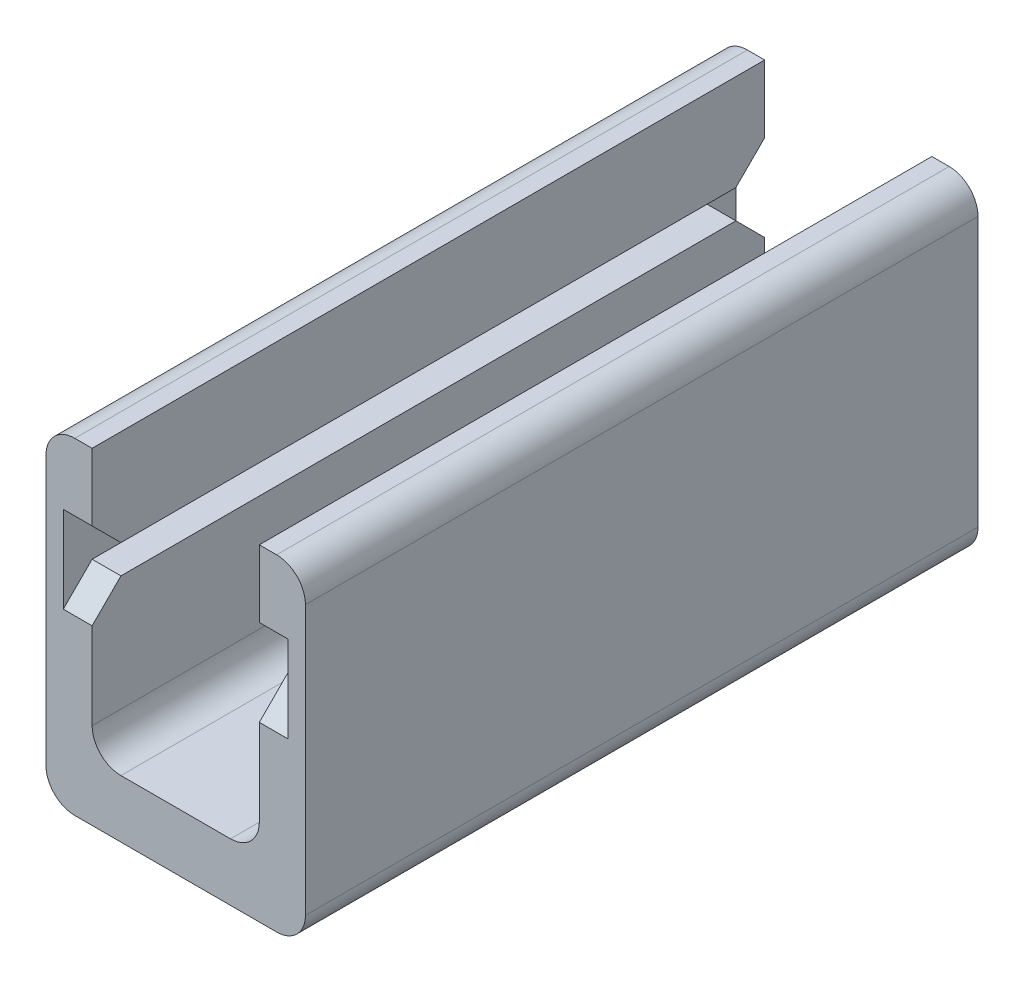
ISO-10303-21;
HEADER;
FILE_DESCRIPTION(('STEP AP214'),'2;1');
FILE_NAME('part.step','',(''),(''),'','','');
FILE_SCHEMA(('AUTOMOTIVE_DESIGN { 1 0 10303 214 1 1 1 1 }'));
ENDSEC;
DATA;
#1=APPLICATION_CONTEXT('core data for automotive mechanical design processes');
#2=APPLICATION_PROTOCOL_DEFINITION('international standard','automotive_design',2000,#1);
#3=PRODUCT_CONTEXT('',#1,'mechanical');
#4=PRODUCT('Part','Part','',(#3));
#5=PRODUCT_RELATED_PRODUCT_CATEGORY('part','',(#4));
#6=PRODUCT_DEFINITION_FORMATION('','',#4);
#7=PRODUCT_DEFINITION_CONTEXT('part definition',#1,'design');
#8=PRODUCT_DEFINITION('design','',#6,#7);
#9=PRODUCT_DEFINITION_SHAPE('','',#8);
#10=(LENGTH_UNIT() NAMED_UNIT(*) SI_UNIT(.MILLI.,.METRE.));
#11=(NAMED_UNIT(*) PLANE_ANGLE_UNIT() SI_UNIT($,.RADIAN.));
#12=(NAMED_UNIT(*) SI_UNIT($,.STERADIAN.) SOLID_ANGLE_UNIT());
#13=UNCERTAINTY_MEASURE_WITH_UNIT(LENGTH_MEASURE(1.E-05),#10,'distance_accuracy_value','');
#14=(GEOMETRIC_REPRESENTATION_CONTEXT(3) GLOBAL_UNCERTAINTY_ASSIGNED_CONTEXT((#13)) GLOBAL_UNIT_ASSIGNED_CONTEXT((#10,
#11,#12)) REPRESENTATION_CONTEXT('',''));
#15=CARTESIAN_POINT('',(0.,0.,0.));
#16=DIRECTION('',(0.,0.,1.));
#17=DIRECTION('',(1.,0.,0.));
#18=AXIS2_PLACEMENT_3D('',#15,#16,#17);
#19=CARTESIAN_POINT('',(6.75,0.,35.));
#20=DIRECTION('',(-1.,0.,0.));
#21=DIRECTION('',(0.,-1.,0.));
#22=AXIS2_PLACEMENT_3D('',#19,#20,#21);
#23=PLANE('',#22);
#24=DIRECTION('',(0.,1.,0.));
#25=VECTOR('',#24,1.);
#26=CARTESIAN_POINT('',(6.75,0.,0.));
#27=LINE('',#26,#25);
#28=CARTESIAN_POINT('',(6.75,1.5,0.));
#29=VERTEX_POINT('',#28);
#30=CARTESIAN_POINT('',(6.75,15.5,0.));
#31=VERTEX_POINT('',#30);
#32=EDGE_CURVE('E283',#29,#31,#27,.T.);
#33=ORIENTED_EDGE('',*,*,#32,.T.);
#34=DIRECTION('',(0.,0.,-1.));
#35=VECTOR('',#34,1.);
#36=CARTESIAN_POINT('',(6.75,15.5,35.));
#37=LINE('',#36,#35);
#38=CARTESIAN_POINT('',(6.75,15.5,35.));
#39=VERTEX_POINT('',#38);
#40=EDGE_CURVE('E363',#31,#39,#37,.F.);
#41=ORIENTED_EDGE('',*,*,#40,.T.);
#42=DIRECTION('',(0.,1.,0.));
#43=VECTOR('',#42,1.);
#44=CARTESIAN_POINT('',(6.75,0.,35.));
#45=LINE('',#44,#43);
#46=CARTESIAN_POINT('',(6.75,1.5,35.));
#47=VERTEX_POINT('',#46);
#48=EDGE_CURVE('E240',#47,#39,#45,.T.);
#49=ORIENTED_EDGE('',*,*,#48,.F.);
#50=DIRECTION('',(0.,0.,-1.));
#51=VECTOR('',#50,1.);
#52=CARTESIAN_POINT('',(6.75,1.5,35.));
#53=LINE('',#52,#51);
#54=EDGE_CURVE('E360',#47,#29,#53,.T.);
#55=ORIENTED_EDGE('',*,*,#54,.T.);
#56=EDGE_LOOP('',(#33,#41,#49,#55));
#57=FACE_BOUND('',#56,.T.);
#58=ADVANCED_FACE('F33',(#57),#23,.F.);
#59=CARTESIAN_POINT('',(6.75,17.,35.));
#60=DIRECTION('',(0.,-1.,0.));
#61=DIRECTION('',(0.,0.,-1.));
#62=AXIS2_PLACEMENT_3D('',#59,#60,#61);
#63=PLANE('',#62);
#64=DIRECTION('',(-1.,0.,0.));
#65=VECTOR('',#64,1.);
#66=CARTESIAN_POINT('',(6.75,17.,35.));
#67=LINE('',#66,#65);
#68=CARTESIAN_POINT('',(5.25,17.,35.));
#69=VERTEX_POINT('',#68);
#70=CARTESIAN_POINT('',(4.35,17.,35.));
#71=VERTEX_POINT('',#70);
#72=EDGE_CURVE('E228',#69,#71,#67,.T.);
#73=ORIENTED_EDGE('',*,*,#72,.F.);
#74=DIRECTION('',(0.,0.,-1.));
#75=VECTOR('',#74,1.);
#76=CARTESIAN_POINT('',(5.25,17.,35.));
#77=LINE('',#76,#75);
#78=CARTESIAN_POINT('',(5.25,17.,0.));
#79=VERTEX_POINT('',#78);
#80=EDGE_CURVE('E358',#69,#79,#77,.T.);
#81=ORIENTED_EDGE('',*,*,#80,.T.);
#82=DIRECTION('',(-1.,0.,0.));
#83=VECTOR('',#82,1.);
#84=CARTESIAN_POINT('',(6.75,17.,0.));
#85=LINE('',#84,#83);
#86=CARTESIAN_POINT('',(4.35,17.,0.));
#87=VERTEX_POINT('',#86);
#88=EDGE_CURVE('E246',#79,#87,#85,.T.);
#89=ORIENTED_EDGE('',*,*,#88,.T.);
#90=DIRECTION('',(0.,0.,-1.));
#91=VECTOR('',#90,1.);
#92=CARTESIAN_POINT('',(4.35,17.,35.));
#93=LINE('',#92,#91);
#94=EDGE_CURVE('E243',#71,#87,#93,.T.);
#95=ORIENTED_EDGE('',*,*,#94,.F.);
#96=EDGE_LOOP('',(#73,#81,#89,#95));
#97=FACE_BOUND('',#96,.T.);
#98=ADVANCED_FACE('F244',(#97),#63,.F.);
#99=CARTESIAN_POINT('',(4.35,17.,35.));
#100=DIRECTION('',(1.,0.,0.));
#101=DIRECTION('',(0.,0.,-1.));
#102=AXIS2_PLACEMENT_3D('',#99,#100,#101);
#103=PLANE('',#102);
#104=DIRECTION('',(0.,-1.,0.));
#105=VECTOR('',#104,1.);
#106=CARTESIAN_POINT('',(4.35,17.,0.));
#107=LINE('',#106,#105);
#108=CARTESIAN_POINT('',(4.35,13.5,0.));
#109=VERTEX_POINT('',#108);
#110=EDGE_CURVE('E287',#87,#109,#107,.T.);
#111=ORIENTED_EDGE('',*,*,#110,.T.);
#112=DIRECTION('',(0.,0.707106781186549,-0.707106781186546));
#113=VECTOR('',#112,1.);
#114=CARTESIAN_POINT('',(4.35,12.,1.49999999999999));
#115=LINE('',#114,#113);
#116=CARTESIAN_POINT('',(4.35,12.,1.49999999999999));
#117=VERTEX_POINT('',#116);
#118=EDGE_CURVE('E415',#109,#117,#115,.F.);
#119=ORIENTED_EDGE('',*,*,#118,.T.);
#120=DIRECTION('',(0.,0.,-1.));
#121=VECTOR('',#120,1.);
#122=CARTESIAN_POINT('',(4.35,12.,35.));
#123=LINE('',#122,#121);
#124=CARTESIAN_POINT('',(4.35,12.,33.5));
#125=VERTEX_POINT('',#124);
#126=EDGE_CURVE('E251',#125,#117,#123,.T.);
#127=ORIENTED_EDGE('',*,*,#126,.F.);
#128=DIRECTION('',(0.,0.707106781186548,0.707106781186548));
#129=VECTOR('',#128,1.);
#130=CARTESIAN_POINT('',(4.35,13.5,35.));
#131=LINE('',#130,#129);
#132=CARTESIAN_POINT('',(4.35,13.5,35.));
#133=VERTEX_POINT('',#132);
#134=EDGE_CURVE('E256',#125,#133,#131,.T.);
#135=ORIENTED_EDGE('',*,*,#134,.T.);
#136=DIRECTION('',(0.,-1.,0.));
#137=VECTOR('',#136,1.);
#138=CARTESIAN_POINT('',(4.35,17.,35.));
#139=LINE('',#138,#137);
#140=EDGE_CURVE('E232',#71,#133,#139,.T.);
#141=ORIENTED_EDGE('',*,*,#140,.F.);
#142=ORIENTED_EDGE('',*,*,#94,.T.);
#143=EDGE_LOOP('',(#111,#119,#127,#135,#141,#142));
#144=FACE_BOUND('',#143,.T.);
#145=ADVANCED_FACE('F253',(#144),#103,.F.);
#146=CARTESIAN_POINT('',(4.35,12.,35.));
#147=DIRECTION('',(0.,1.,0.));
#148=DIRECTION('',(0.,0.,1.));
#149=AXIS2_PLACEMENT_3D('',#146,#147,#148);
#150=PLANE('',#149);
#151=ORIENTED_EDGE('',*,*,#126,.T.);
#152=DIRECTION('',(1.,0.,0.));
#153=VECTOR('',#152,1.);
#154=CARTESIAN_POINT('',(4.35,12.,1.49999999999999));
#155=LINE('',#154,#153);
#156=CARTESIAN_POINT('',(5.85,12.,1.49999999999999));
#157=VERTEX_POINT('',#156);
#158=EDGE_CURVE('E411',#117,#157,#155,.T.);
#159=ORIENTED_EDGE('',*,*,#158,.T.);
#160=DIRECTION('',(0.,0.,-1.));
#161=VECTOR('',#160,1.);
#162=CARTESIAN_POINT('',(5.85,12.,35.));
#163=LINE('',#162,#161);
#164=CARTESIAN_POINT('',(5.85,12.,33.5));
#165=VERTEX_POINT('',#164);
#166=EDGE_CURVE('E332',#165,#157,#163,.T.);
#167=ORIENTED_EDGE('',*,*,#166,.F.);
#168=DIRECTION('',(-1.,0.,0.));
#169=VECTOR('',#168,1.);
#170=CARTESIAN_POINT('',(4.35,12.,33.5));
#171=LINE('',#170,#169);
#172=EDGE_CURVE('E409',#165,#125,#171,.T.);
#173=ORIENTED_EDGE('',*,*,#172,.T.);
#174=EDGE_LOOP('',(#151,#159,#167,#173));
#175=FACE_BOUND('',#174,.T.);
#176=ADVANCED_FACE('F547',(#175),#150,.F.);
#177=CARTESIAN_POINT('',(5.85,12.,35.));
#178=DIRECTION('',(1.,0.,0.));
#179=DIRECTION('',(0.,1.,0.));
#180=AXIS2_PLACEMENT_3D('',#177,#178,#179);
#181=PLANE('',#180);
#182=DIRECTION('',(0.,-1.,0.));
#183=VECTOR('',#182,1.);
#184=CARTESIAN_POINT('',(5.85,12.,0.));
#185=LINE('',#184,#183);
#186=CARTESIAN_POINT('',(5.85,13.5,0.));
#187=VERTEX_POINT('',#186);
#188=CARTESIAN_POINT('',(5.85,9.,0.));
#189=VERTEX_POINT('',#188);
#190=EDGE_CURVE('E289',#187,#189,#185,.T.);
#191=ORIENTED_EDGE('',*,*,#190,.T.);
#192=DIRECTION('',(0.,-0.707106781186548,-0.707106781186547));
#193=VECTOR('',#192,1.);
#194=CARTESIAN_POINT('',(5.85000000000002,28.,19.));
#195=LINE('',#194,#193);
#196=CARTESIAN_POINT('',(5.85,10.5,1.5));
#197=VERTEX_POINT('',#196);
#198=EDGE_CURVE('E445',#189,#197,#195,.F.);
#199=ORIENTED_EDGE('',*,*,#198,.T.);
#200=DIRECTION('',(0.,0.,-1.));
#201=VECTOR('',#200,1.);
#202=CARTESIAN_POINT('',(5.85,10.5,35.));
#203=LINE('',#202,#201);
#204=CARTESIAN_POINT('',(5.85,10.5,33.5));
#205=VERTEX_POINT('',#204);
#206=EDGE_CURVE('E329',#205,#197,#203,.T.);
#207=ORIENTED_EDGE('',*,*,#206,.F.);
#208=DIRECTION('',(0.,-0.707106781186548,0.707106781186548));
#209=VECTOR('',#208,1.);
#210=CARTESIAN_POINT('',(5.85,10.5,33.5));
#211=LINE('',#210,#209);
#212=CARTESIAN_POINT('',(5.85,9.,35.));
#213=VERTEX_POINT('',#212);
#214=EDGE_CURVE('E455',#205,#213,#211,.T.);
#215=ORIENTED_EDGE('',*,*,#214,.T.);
#216=DIRECTION('',(0.,-1.,0.));
#217=VECTOR('',#216,1.);
#218=CARTESIAN_POINT('',(5.85,12.,35.));
#219=LINE('',#218,#217);
#220=CARTESIAN_POINT('',(5.85,13.5,35.));
#221=VERTEX_POINT('',#220);
#222=EDGE_CURVE('E48',#221,#213,#219,.T.);
#223=ORIENTED_EDGE('',*,*,#222,.F.);
#224=DIRECTION('',(0.,-0.707106781186548,-0.707106781186548));
#225=VECTOR('',#224,1.);
#226=CARTESIAN_POINT('',(5.85,12.75,34.25));
#227=LINE('',#226,#225);
#228=EDGE_CURVE('E457',#221,#165,#227,.T.);
#229=ORIENTED_EDGE('',*,*,#228,.T.);
#230=ORIENTED_EDGE('',*,*,#166,.T.);
#231=DIRECTION('',(0.,-0.707106781186549,0.707106781186546));
#232=VECTOR('',#231,1.);
#233=CARTESIAN_POINT('',(5.84999999999998,-4.75000000000001,18.2499999999999));
#234=LINE('',#233,#232);
#235=EDGE_CURVE('E447',#157,#187,#234,.F.);
#236=ORIENTED_EDGE('',*,*,#235,.T.);
#237=EDGE_LOOP('',(#191,#199,#207,#215,#223,#229,#230,#236));
#238=FACE_BOUND('',#237,.T.);
#239=ADVANCED_FACE('F549',(#238),#181,.F.);
#240=CARTESIAN_POINT('',(5.85,10.5,35.));
#241=DIRECTION('',(0.,-1.,0.));
#242=DIRECTION('',(0.,0.,-1.));
#243=AXIS2_PLACEMENT_3D('',#240,#241,#242);
#244=PLANE('',#243);
#245=ORIENTED_EDGE('',*,*,#206,.T.);
#246=DIRECTION('',(-1.,0.,0.));
#247=VECTOR('',#246,1.);
#248=CARTESIAN_POINT('',(5.85,10.5,1.5));
#249=LINE('',#248,#247);
#250=CARTESIAN_POINT('',(4.35,10.5,1.5));
#251=VERTEX_POINT('',#250);
#252=EDGE_CURVE('E392',#197,#251,#249,.T.);
#253=ORIENTED_EDGE('',*,*,#252,.T.);
#254=DIRECTION('',(0.,0.,-1.));
#255=VECTOR('',#254,1.);
#256=CARTESIAN_POINT('',(4.35,10.5,35.));
#257=LINE('',#256,#255);
#258=CARTESIAN_POINT('',(4.35,10.5,33.5));
#259=VERTEX_POINT('',#258);
#260=EDGE_CURVE('E326',#259,#251,#257,.T.);
#261=ORIENTED_EDGE('',*,*,#260,.F.);
#262=DIRECTION('',(1.,0.,0.));
#263=VECTOR('',#262,1.);
#264=CARTESIAN_POINT('',(5.85,10.5,33.5));
#265=LINE('',#264,#263);
#266=EDGE_CURVE('E390',#259,#205,#265,.T.);
#267=ORIENTED_EDGE('',*,*,#266,.T.);
#268=EDGE_LOOP('',(#245,#253,#261,#267));
#269=FACE_BOUND('',#268,.T.);
#270=ADVANCED_FACE('F755',(#269),#244,.F.);
#271=CARTESIAN_POINT('',(4.35,10.5,35.));
#272=DIRECTION('',(1.,0.,0.));
#273=DIRECTION('',(0.,1.,0.));
#274=AXIS2_PLACEMENT_3D('',#271,#272,#273);
#275=PLANE('',#274);
#276=ORIENTED_EDGE('',*,*,#260,.T.);
#277=DIRECTION('',(0.,0.707106781186548,0.707106781186547));
#278=VECTOR('',#277,1.);
#279=CARTESIAN_POINT('',(4.35,10.5,1.5));
#280=LINE('',#279,#278);
#281=CARTESIAN_POINT('',(4.35,9.,0.));
#282=VERTEX_POINT('',#281);
#283=EDGE_CURVE('E397',#251,#282,#280,.F.);
#284=ORIENTED_EDGE('',*,*,#283,.T.);
#285=DIRECTION('',(0.,-1.,0.));
#286=VECTOR('',#285,1.);
#287=CARTESIAN_POINT('',(4.35,10.5,0.));
#288=LINE('',#287,#286);
#289=CARTESIAN_POINT('',(4.35,4.5,0.));
#290=VERTEX_POINT('',#289);
#291=EDGE_CURVE('E291',#282,#290,#288,.T.);
#292=ORIENTED_EDGE('',*,*,#291,.T.);
#293=DIRECTION('',(0.,0.,-1.));
#294=VECTOR('',#293,1.);
#295=CARTESIAN_POINT('',(4.35,4.5,35.));
#296=LINE('',#295,#294);
#297=CARTESIAN_POINT('',(4.35,4.5,35.));
#298=VERTEX_POINT('',#297);
#299=EDGE_CURVE('E375',#290,#298,#296,.F.);
#300=ORIENTED_EDGE('',*,*,#299,.T.);
#301=DIRECTION('',(0.,-1.,0.));
#302=VECTOR('',#301,1.);
#303=CARTESIAN_POINT('',(4.35,10.5,35.));
#304=LINE('',#303,#302);
#305=CARTESIAN_POINT('',(4.35,9.,35.));
#306=VERTEX_POINT('',#305);
#307=EDGE_CURVE('E258',#306,#298,#304,.T.);
#308=ORIENTED_EDGE('',*,*,#307,.F.);
#309=DIRECTION('',(0.,0.707106781186548,-0.707106781186548));
#310=VECTOR('',#309,1.);
#311=CARTESIAN_POINT('',(4.35,9.,35.));
#312=LINE('',#311,#310);
#313=EDGE_CURVE('E395',#306,#259,#312,.T.);
#314=ORIENTED_EDGE('',*,*,#313,.T.);
#315=EDGE_LOOP('',(#276,#284,#292,#300,#308,#314));
#316=FACE_BOUND('',#315,.T.);
#317=ADVANCED_FACE('F746',(#316),#275,.F.);
#318=CARTESIAN_POINT('',(4.35,3.,35.));
#319=DIRECTION('',(0.,-1.,0.));
#320=DIRECTION('',(0.,0.,-1.));
#321=AXIS2_PLACEMENT_3D('',#318,#319,#320);
#322=PLANE('',#321);
#323=DIRECTION('',(-1.,0.,0.));
#324=VECTOR('',#323,1.);
#325=CARTESIAN_POINT('',(4.35,3.,35.));
#326=LINE('',#325,#324);
#327=CARTESIAN_POINT('',(2.85,3.,35.));
#328=VERTEX_POINT('',#327);
#329=CARTESIAN_POINT('',(-2.85,3.,35.));
#330=VERTEX_POINT('',#329);
#331=EDGE_CURVE('E263',#328,#330,#326,.T.);
#332=ORIENTED_EDGE('',*,*,#331,.F.);
#333=DIRECTION('',(0.,0.,-1.));
#334=VECTOR('',#333,1.);
#335=CARTESIAN_POINT('',(2.85,3.,0.));
#336=LINE('',#335,#334);
#337=CARTESIAN_POINT('',(2.85,3.,0.));
#338=VERTEX_POINT('',#337);
#339=EDGE_CURVE('E372',#328,#338,#336,.T.);
#340=ORIENTED_EDGE('',*,*,#339,.T.);
#341=DIRECTION('',(-1.,0.,0.));
#342=VECTOR('',#341,1.);
#343=CARTESIAN_POINT('',(4.35,3.,0.));
#344=LINE('',#343,#342);
#345=CARTESIAN_POINT('',(-2.85,3.,0.));
#346=VERTEX_POINT('',#345);
#347=EDGE_CURVE('E293',#338,#346,#344,.T.);
#348=ORIENTED_EDGE('',*,*,#347,.T.);
#349=DIRECTION('',(0.,0.,-1.));
#350=VECTOR('',#349,1.);
#351=CARTESIAN_POINT('',(-2.85,3.,35.));
#352=LINE('',#351,#350);
#353=EDGE_CURVE('E370',#346,#330,#352,.F.);
#354=ORIENTED_EDGE('',*,*,#353,.T.);
#355=EDGE_LOOP('',(#332,#340,#348,#354));
#356=FACE_BOUND('',#355,.T.);
#357=ADVANCED_FACE('F738',(#356),#322,.F.);
#358=CARTESIAN_POINT('',(-4.35,3.,35.));
#359=DIRECTION('',(-1.,0.,0.));
#360=DIRECTION('',(0.,-1.,0.));
#361=AXIS2_PLACEMENT_3D('',#358,#359,#360);
#362=PLANE('',#361);
#363=DIRECTION('',(0.,1.,0.));
#364=VECTOR('',#363,1.);
#365=CARTESIAN_POINT('',(-4.35,3.,0.));
#366=LINE('',#365,#364);
#367=CARTESIAN_POINT('',(-4.35,4.5,0.));
#368=VERTEX_POINT('',#367);
#369=CARTESIAN_POINT('',(-4.35,9.,0.));
#370=VERTEX_POINT('',#369);
#371=EDGE_CURVE('E296',#368,#370,#366,.T.);
#372=ORIENTED_EDGE('',*,*,#371,.T.);
#373=DIRECTION('',(0.,-0.707106781186548,-0.707106781186547));
#374=VECTOR('',#373,1.);
#375=CARTESIAN_POINT('',(-4.35,10.5,1.5));
#376=LINE('',#375,#374);
#377=CARTESIAN_POINT('',(-4.35,10.5,1.5));
#378=VERTEX_POINT('',#377);
#379=EDGE_CURVE('E433',#370,#378,#376,.F.);
#380=ORIENTED_EDGE('',*,*,#379,.T.);
#381=DIRECTION('',(0.,0.,-1.));
#382=VECTOR('',#381,1.);
#383=CARTESIAN_POINT('',(-4.35,10.5,35.));
#384=LINE('',#383,#382);
#385=CARTESIAN_POINT('',(-4.35,10.5,33.5));
#386=VERTEX_POINT('',#385);
#387=EDGE_CURVE('E323',#386,#378,#384,.T.);
#388=ORIENTED_EDGE('',*,*,#387,.F.);
#389=DIRECTION('',(0.,-0.707106781186548,0.707106781186548));
#390=VECTOR('',#389,1.);
#391=CARTESIAN_POINT('',(-4.35,9.,35.));
#392=LINE('',#391,#390);
#393=CARTESIAN_POINT('',(-4.35,9.,35.));
#394=VERTEX_POINT('',#393);
#395=EDGE_CURVE('E431',#386,#394,#392,.T.);
#396=ORIENTED_EDGE('',*,*,#395,.T.);
#397=DIRECTION('',(0.,1.,0.));
#398=VECTOR('',#397,1.);
#399=CARTESIAN_POINT('',(-4.35,3.,35.));
#400=LINE('',#399,#398);
#401=CARTESIAN_POINT('',(-4.35,4.5,35.));
#402=VERTEX_POINT('',#401);
#403=EDGE_CURVE('E266',#402,#394,#400,.T.);
#404=ORIENTED_EDGE('',*,*,#403,.F.);
#405=DIRECTION('',(0.,0.,-1.));
#406=VECTOR('',#405,1.);
#407=CARTESIAN_POINT('',(-4.35,4.5,0.));
#408=LINE('',#407,#406);
#409=EDGE_CURVE('E378',#402,#368,#408,.T.);
#410=ORIENTED_EDGE('',*,*,#409,.T.);
#411=EDGE_LOOP('',(#372,#380,#388,#396,#404,#410));
#412=FACE_BOUND('',#411,.T.);
#413=ADVANCED_FACE('F473',(#412),#362,.F.);
#414=CARTESIAN_POINT('',(-4.35,10.5,35.));
#415=DIRECTION('',(0.,-1.,0.));
#416=DIRECTION('',(0.,0.,-1.));
#417=AXIS2_PLACEMENT_3D('',#414,#415,#416);
#418=PLANE('',#417);
#419=ORIENTED_EDGE('',*,*,#387,.T.);
#420=DIRECTION('',(-1.,0.,0.));
#421=VECTOR('',#420,1.);
#422=CARTESIAN_POINT('',(-4.35,10.5,1.5));
#423=LINE('',#422,#421);
#424=CARTESIAN_POINT('',(-5.85,10.5,1.5));
#425=VERTEX_POINT('',#424);
#426=EDGE_CURVE('E428',#378,#425,#423,.T.);
#427=ORIENTED_EDGE('',*,*,#426,.T.);
#428=DIRECTION('',(0.,0.,-1.));
#429=VECTOR('',#428,1.);
#430=CARTESIAN_POINT('',(-5.85,10.5,35.));
#431=LINE('',#430,#429);
#432=CARTESIAN_POINT('',(-5.85,10.5,33.5));
#433=VERTEX_POINT('',#432);
#434=EDGE_CURVE('E320',#433,#425,#431,.T.);
#435=ORIENTED_EDGE('',*,*,#434,.F.);
#436=DIRECTION('',(1.,0.,0.));
#437=VECTOR('',#436,1.);
#438=CARTESIAN_POINT('',(-4.35,10.5,33.5));
#439=LINE('',#438,#437);
#440=EDGE_CURVE('E426',#433,#386,#439,.T.);
#441=ORIENTED_EDGE('',*,*,#440,.T.);
#442=EDGE_LOOP('',(#419,#427,#435,#441));
#443=FACE_BOUND('',#442,.T.);
#444=ADVANCED_FACE('F466',(#443),#418,.F.);
#445=CARTESIAN_POINT('',(-5.85,10.5,35.));
#446=DIRECTION('',(-1.,0.,0.));
#447=DIRECTION('',(0.,-1.,0.));
#448=AXIS2_PLACEMENT_3D('',#445,#446,#447);
#449=PLANE('',#448);
#450=DIRECTION('',(0.,1.,0.));
#451=VECTOR('',#450,1.);
#452=CARTESIAN_POINT('',(-5.85,10.5,0.));
#453=LINE('',#452,#451);
#454=CARTESIAN_POINT('',(-5.85,9.,0.));
#455=VERTEX_POINT('',#454);
#456=CARTESIAN_POINT('',(-5.85,13.5,0.));
#457=VERTEX_POINT('',#456);
#458=EDGE_CURVE('E299',#455,#457,#453,.T.);
#459=ORIENTED_EDGE('',*,*,#458,.T.);
#460=DIRECTION('',(0.,0.707106781186549,-0.707106781186546));
#461=VECTOR('',#460,1.);
#462=CARTESIAN_POINT('',(-5.84999999999998,-5.50000000000001,18.9999999999999));
#463=LINE('',#462,#461);
#464=CARTESIAN_POINT('',(-5.85,12.,1.49999999999999));
#465=VERTEX_POINT('',#464);
#466=EDGE_CURVE('E450',#457,#465,#463,.F.);
#467=ORIENTED_EDGE('',*,*,#466,.T.);
#468=DIRECTION('',(0.,0.,-1.));
#469=VECTOR('',#468,1.);
#470=CARTESIAN_POINT('',(-5.85,12.,35.));
#471=LINE('',#470,#469);
#472=CARTESIAN_POINT('',(-5.85,12.,33.5));
#473=VERTEX_POINT('',#472);
#474=EDGE_CURVE('E317',#473,#465,#471,.T.);
#475=ORIENTED_EDGE('',*,*,#474,.F.);
#476=DIRECTION('',(0.,0.707106781186548,0.707106781186548));
#477=VECTOR('',#476,1.);
#478=CARTESIAN_POINT('',(-5.85,12.,33.5));
#479=LINE('',#478,#477);
#480=CARTESIAN_POINT('',(-5.85,13.5,35.));
#481=VERTEX_POINT('',#480);
#482=EDGE_CURVE('E11',#473,#481,#479,.T.);
#483=ORIENTED_EDGE('',*,*,#482,.T.);
#484=DIRECTION('',(0.,1.,0.));
#485=VECTOR('',#484,1.);
#486=CARTESIAN_POINT('',(-5.85,10.5,35.));
#487=LINE('',#486,#485);
#488=CARTESIAN_POINT('',(-5.85,9.,35.));
#489=VERTEX_POINT('',#488);
#490=EDGE_CURVE('E269',#489,#481,#487,.T.);
#491=ORIENTED_EDGE('',*,*,#490,.F.);
#492=DIRECTION('',(0.,0.707106781186548,-0.707106781186548));
#493=VECTOR('',#492,1.);
#494=CARTESIAN_POINT('',(-5.85,9.75,34.25));
#495=LINE('',#494,#493);
#496=EDGE_CURVE('E41',#489,#433,#495,.T.);
#497=ORIENTED_EDGE('',*,*,#496,.T.);
#498=ORIENTED_EDGE('',*,*,#434,.T.);
#499=DIRECTION('',(0.,0.707106781186548,0.707106781186547));
#500=VECTOR('',#499,1.);
#501=CARTESIAN_POINT('',(-5.85000000000002,27.25,18.25));
#502=LINE('',#501,#500);
#503=EDGE_CURVE('E452',#425,#455,#502,.F.);
#504=ORIENTED_EDGE('',*,*,#503,.T.);
#505=EDGE_LOOP('',(#459,#467,#475,#483,#491,#497,#498,#504));
#506=FACE_BOUND('',#505,.T.);
#507=ADVANCED_FACE('F461',(#506),#449,.F.);
#508=CARTESIAN_POINT('',(-5.85,12.,35.));
#509=DIRECTION('',(0.,1.,0.));
#510=DIRECTION('',(0.,0.,1.));
#511=AXIS2_PLACEMENT_3D('',#508,#509,#510);
#512=PLANE('',#511);
#513=ORIENTED_EDGE('',*,*,#474,.T.);
#514=DIRECTION('',(1.,0.,0.));
#515=VECTOR('',#514,1.);
#516=CARTESIAN_POINT('',(-5.85,12.,1.49999999999999));
#517=LINE('',#516,#515);
#518=CARTESIAN_POINT('',(-4.35,12.,1.49999999999999));
#519=VERTEX_POINT('',#518);
#520=EDGE_CURVE('E419',#465,#519,#517,.T.);
#521=ORIENTED_EDGE('',*,*,#520,.T.);
#522=DIRECTION('',(0.,0.,-1.));
#523=VECTOR('',#522,1.);
#524=CARTESIAN_POINT('',(-4.35,12.,35.));
#525=LINE('',#524,#523);
#526=CARTESIAN_POINT('',(-4.35,12.,33.5));
#527=VERTEX_POINT('',#526);
#528=EDGE_CURVE('E314',#527,#519,#525,.T.);
#529=ORIENTED_EDGE('',*,*,#528,.F.);
#530=DIRECTION('',(-1.,0.,0.));
#531=VECTOR('',#530,1.);
#532=CARTESIAN_POINT('',(-5.85,12.,33.5));
#533=LINE('',#532,#531);
#534=EDGE_CURVE('E417',#527,#473,#533,.T.);
#535=ORIENTED_EDGE('',*,*,#534,.T.);
#536=EDGE_LOOP('',(#513,#521,#529,#535));
#537=FACE_BOUND('',#536,.T.);
#538=ADVANCED_FACE('F499',(#537),#512,.F.);
#539=CARTESIAN_POINT('',(-4.35,12.,35.));
#540=DIRECTION('',(-1.,0.,0.));
#541=DIRECTION('',(0.,0.,1.));
#542=AXIS2_PLACEMENT_3D('',#539,#540,#541);
#543=PLANE('',#542);
#544=ORIENTED_EDGE('',*,*,#528,.T.);
#545=DIRECTION('',(0.,-0.707106781186549,0.707106781186546));
#546=VECTOR('',#545,1.);
#547=CARTESIAN_POINT('',(-4.35,12.,1.49999999999999));
#548=LINE('',#547,#546);
#549=CARTESIAN_POINT('',(-4.35,13.5,0.));
#550=VERTEX_POINT('',#549);
#551=EDGE_CURVE('E424',#519,#550,#548,.F.);
#552=ORIENTED_EDGE('',*,*,#551,.T.);
#553=DIRECTION('',(0.,1.,0.));
#554=VECTOR('',#553,1.);
#555=CARTESIAN_POINT('',(-4.35,12.,0.));
#556=LINE('',#555,#554);
#557=CARTESIAN_POINT('',(-4.35,17.,0.));
#558=VERTEX_POINT('',#557);
#559=EDGE_CURVE('E301',#550,#558,#556,.T.);
#560=ORIENTED_EDGE('',*,*,#559,.T.);
#561=DIRECTION('',(0.,0.,-1.));
#562=VECTOR('',#561,1.);
#563=CARTESIAN_POINT('',(-4.35,17.,35.));
#564=LINE('',#563,#562);
#565=CARTESIAN_POINT('',(-4.35,17.,35.));
#566=VERTEX_POINT('',#565);
#567=EDGE_CURVE('E282',#566,#558,#564,.T.);
#568=ORIENTED_EDGE('',*,*,#567,.F.);
#569=DIRECTION('',(0.,1.,0.));
#570=VECTOR('',#569,1.);
#571=CARTESIAN_POINT('',(-4.35,12.,35.));
#572=LINE('',#571,#570);
#573=CARTESIAN_POINT('',(-4.35,13.5,35.));
#574=VERTEX_POINT('',#573);
#575=EDGE_CURVE('E271',#574,#566,#572,.T.);
#576=ORIENTED_EDGE('',*,*,#575,.F.);
#577=DIRECTION('',(0.,-0.707106781186548,-0.707106781186548));
#578=VECTOR('',#577,1.);
#579=CARTESIAN_POINT('',(-4.35,13.5,35.));
#580=LINE('',#579,#578);
#581=EDGE_CURVE('E422',#574,#527,#580,.T.);
#582=ORIENTED_EDGE('',*,*,#581,.T.);
#583=EDGE_LOOP('',(#544,#552,#560,#568,#576,#582));
#584=FACE_BOUND('',#583,.T.);
#585=ADVANCED_FACE('F502',(#584),#543,.F.);
#586=CARTESIAN_POINT('',(-4.35,17.,35.));
#587=DIRECTION('',(0.,-1.,0.));
#588=DIRECTION('',(0.,0.,-1.));
#589=AXIS2_PLACEMENT_3D('',#586,#587,#588);
#590=PLANE('',#589);
#591=DIRECTION('',(-1.,0.,0.));
#592=VECTOR('',#591,1.);
#593=CARTESIAN_POINT('',(-4.35,17.,0.));
#594=LINE('',#593,#592);
#595=CARTESIAN_POINT('',(-5.25,17.,0.));
#596=VERTEX_POINT('',#595);
#597=EDGE_CURVE('E303',#558,#596,#594,.T.);
#598=ORIENTED_EDGE('',*,*,#597,.T.);
#599=DIRECTION('',(0.,0.,-1.));
#600=VECTOR('',#599,1.);
#601=CARTESIAN_POINT('',(-5.25,17.,35.));
#602=LINE('',#601,#600);
#603=CARTESIAN_POINT('',(-5.25,17.,35.));
#604=VERTEX_POINT('',#603);
#605=EDGE_CURVE('E349',#596,#604,#602,.F.);
#606=ORIENTED_EDGE('',*,*,#605,.T.);
#607=DIRECTION('',(-1.,0.,0.));
#608=VECTOR('',#607,1.);
#609=CARTESIAN_POINT('',(-4.35,17.,35.));
#610=LINE('',#609,#608);
#611=EDGE_CURVE('E273',#566,#604,#610,.T.);
#612=ORIENTED_EDGE('',*,*,#611,.F.);
#613=ORIENTED_EDGE('',*,*,#567,.T.);
#614=EDGE_LOOP('',(#598,#606,#612,#613));
#615=FACE_BOUND('',#614,.T.);
#616=ADVANCED_FACE('F511',(#615),#590,.F.);
#617=CARTESIAN_POINT('',(-6.75,17.,35.));
#618=DIRECTION('',(1.,0.,0.));
#619=DIRECTION('',(0.,1.,0.));
#620=AXIS2_PLACEMENT_3D('',#617,#618,#619);
#621=PLANE('',#620);
#622=DIRECTION('',(0.,-1.,0.));
#623=VECTOR('',#622,1.);
#624=CARTESIAN_POINT('',(-6.75,17.,35.));
#625=LINE('',#624,#623);
#626=CARTESIAN_POINT('',(-6.75,15.5,35.));
#627=VERTEX_POINT('',#626);
#628=CARTESIAN_POINT('',(-6.75,1.5,35.));
#629=VERTEX_POINT('',#628);
#630=EDGE_CURVE('E276',#627,#629,#625,.T.);
#631=ORIENTED_EDGE('',*,*,#630,.F.);
#632=DIRECTION('',(0.,0.,-1.));
#633=VECTOR('',#632,1.);
#634=CARTESIAN_POINT('',(-6.75,15.5,35.));
#635=LINE('',#634,#633);
#636=CARTESIAN_POINT('',(-6.75,15.5,0.));
#637=VERTEX_POINT('',#636);
#638=EDGE_CURVE('E338',#627,#637,#635,.T.);
#639=ORIENTED_EDGE('',*,*,#638,.T.);
#640=DIRECTION('',(0.,-1.,0.));
#641=VECTOR('',#640,1.);
#642=CARTESIAN_POINT('',(-6.75,17.,0.));
#643=LINE('',#642,#641);
#644=CARTESIAN_POINT('',(-6.75,1.5,0.));
#645=VERTEX_POINT('',#644);
#646=EDGE_CURVE('E306',#637,#645,#643,.T.);
#647=ORIENTED_EDGE('',*,*,#646,.T.);
#648=DIRECTION('',(0.,0.,-1.));
#649=VECTOR('',#648,1.);
#650=CARTESIAN_POINT('',(-6.75,1.5,35.));
#651=LINE('',#650,#649);
#652=EDGE_CURVE('E250',#645,#629,#651,.F.);
#653=ORIENTED_EDGE('',*,*,#652,.T.);
#654=EDGE_LOOP('',(#631,#639,#647,#653));
#655=FACE_BOUND('',#654,.T.);
#656=ADVANCED_FACE('F519',(#655),#621,.F.);
#657=CARTESIAN_POINT('',(-6.75,0.,35.));
#658=DIRECTION('',(0.,1.,0.));
#659=DIRECTION('',(-1.,0.,0.));
#660=AXIS2_PLACEMENT_3D('',#657,#658,#659);
#661=PLANE('',#660);
#662=DIRECTION('',(1.,0.,0.));
#663=VECTOR('',#662,1.);
#664=CARTESIAN_POINT('',(-6.75,0.,0.));
#665=LINE('',#664,#663);
#666=CARTESIAN_POINT('',(-5.25,0.,0.));
#667=VERTEX_POINT('',#666);
#668=CARTESIAN_POINT('',(5.25,0.,0.));
#669=VERTEX_POINT('',#668);
#670=EDGE_CURVE('E309',#667,#669,#665,.T.);
#671=ORIENTED_EDGE('',*,*,#670,.T.);
#672=DIRECTION('',(0.,0.,-1.));
#673=VECTOR('',#672,1.);
#674=CARTESIAN_POINT('',(5.25,0.,35.));
#675=LINE('',#674,#673);
#676=CARTESIAN_POINT('',(5.25,0.,35.));
#677=VERTEX_POINT('',#676);
#678=EDGE_CURVE('E368',#669,#677,#675,.F.);
#679=ORIENTED_EDGE('',*,*,#678,.T.);
#680=DIRECTION('',(1.,0.,0.));
#681=VECTOR('',#680,1.);
#682=CARTESIAN_POINT('',(-6.75,0.,35.));
#683=LINE('',#682,#681);
#684=CARTESIAN_POINT('',(-5.25,0.,35.));
#685=VERTEX_POINT('',#684);
#686=EDGE_CURVE('E279',#685,#677,#683,.T.);
#687=ORIENTED_EDGE('',*,*,#686,.F.);
#688=DIRECTION('',(0.,0.,-1.));
#689=VECTOR('',#688,1.);
#690=CARTESIAN_POINT('',(-5.25,0.,35.));
#691=LINE('',#690,#689);
#692=EDGE_CURVE('E365',#685,#667,#691,.T.);
#693=ORIENTED_EDGE('',*,*,#692,.T.);
#694=EDGE_LOOP('',(#671,#679,#687,#693));
#695=FACE_BOUND('',#694,.T.);
#696=ADVANCED_FACE('F528',(#695),#661,.F.);
#697=CARTESIAN_POINT('',(0.,0.,35.));
#698=DIRECTION('',(0.,0.,1.));
#699=DIRECTION('',(1.,0.,0.));
#700=AXIS2_PLACEMENT_3D('',#697,#698,#699);
#701=PLANE('',#700);
#702=ORIENTED_EDGE('',*,*,#222,.T.);
#703=DIRECTION('',(-1.,0.,0.));
#704=VECTOR('',#703,1.);
#705=CARTESIAN_POINT('',(4.35,9.,35.));
#706=LINE('',#705,#704);
#707=EDGE_CURVE('E443',#213,#306,#706,.T.);
#708=ORIENTED_EDGE('',*,*,#707,.T.);
#709=ORIENTED_EDGE('',*,*,#307,.T.);
#710=CARTESIAN_POINT('',(2.85,4.5,35.));
#711=DIRECTION('',(0.,0.,1.));
#712=DIRECTION('',(1.,0.,0.));
#713=AXIS2_PLACEMENT_3D('',#710,#711,#712);
#714=CIRCLE('',#713,1.5);
#715=EDGE_CURVE('E384',#298,#328,#714,.F.);
#716=ORIENTED_EDGE('',*,*,#715,.T.);
#717=ORIENTED_EDGE('',*,*,#331,.T.);
#718=CARTESIAN_POINT('',(-2.85,4.5,35.));
#719=DIRECTION('',(0.,0.,1.));
#720=DIRECTION('',(1.,0.,0.));
#721=AXIS2_PLACEMENT_3D('',#718,#719,#720);
#722=CIRCLE('',#721,1.5);
#723=EDGE_CURVE('E388',#330,#402,#722,.F.);
#724=ORIENTED_EDGE('',*,*,#723,.T.);
#725=ORIENTED_EDGE('',*,*,#403,.T.);
#726=DIRECTION('',(-1.,0.,0.));
#727=VECTOR('',#726,1.);
#728=CARTESIAN_POINT('',(-5.85,9.,35.));
#729=LINE('',#728,#727);
#730=EDGE_CURVE('E438',#394,#489,#729,.T.);
#731=ORIENTED_EDGE('',*,*,#730,.T.);
#732=ORIENTED_EDGE('',*,*,#490,.T.);
#733=DIRECTION('',(1.,0.,0.));
#734=VECTOR('',#733,1.);
#735=CARTESIAN_POINT('',(-4.35,13.5,35.));
#736=LINE('',#735,#734);
#737=EDGE_CURVE('E435',#481,#574,#736,.T.);
#738=ORIENTED_EDGE('',*,*,#737,.T.);
#739=ORIENTED_EDGE('',*,*,#575,.T.);
#740=ORIENTED_EDGE('',*,*,#611,.T.);
#741=CARTESIAN_POINT('',(-5.25,15.5,35.));
#742=DIRECTION('',(0.,0.,1.));
#743=DIRECTION('',(1.,0.,0.));
#744=AXIS2_PLACEMENT_3D('',#741,#742,#743);
#745=CIRCLE('',#744,1.5);
#746=EDGE_CURVE('E356',#604,#627,#745,.T.);
#747=ORIENTED_EDGE('',*,*,#746,.T.);
#748=ORIENTED_EDGE('',*,*,#630,.T.);
#749=CARTESIAN_POINT('',(-5.25,1.5,35.));
#750=DIRECTION('',(0.,0.,1.));
#751=DIRECTION('',(1.,0.,0.));
#752=AXIS2_PLACEMENT_3D('',#749,#750,#751);
#753=CIRCLE('',#752,1.5);
#754=EDGE_CURVE('E351',#629,#685,#753,.T.);
#755=ORIENTED_EDGE('',*,*,#754,.T.);
#756=ORIENTED_EDGE('',*,*,#686,.T.);
#757=CARTESIAN_POINT('',(5.25,1.5,35.));
#758=DIRECTION('',(0.,0.,1.));
#759=DIRECTION('',(1.,0.,0.));
#760=AXIS2_PLACEMENT_3D('',#757,#758,#759);
#761=CIRCLE('',#760,1.5);
#762=EDGE_CURVE('E353',#677,#47,#761,.T.);
#763=ORIENTED_EDGE('',*,*,#762,.T.);
#764=ORIENTED_EDGE('',*,*,#48,.T.);
#765=CARTESIAN_POINT('',(5.25,15.5,35.));
#766=DIRECTION('',(0.,0.,1.));
#767=DIRECTION('',(1.,0.,0.));
#768=AXIS2_PLACEMENT_3D('',#765,#766,#767);
#769=CIRCLE('',#768,1.5);
#770=EDGE_CURVE('E236',#39,#69,#769,.T.);
#771=ORIENTED_EDGE('',*,*,#770,.T.);
#772=ORIENTED_EDGE('',*,*,#72,.T.);
#773=ORIENTED_EDGE('',*,*,#140,.T.);
#774=DIRECTION('',(1.,0.,0.));
#775=VECTOR('',#774,1.);
#776=CARTESIAN_POINT('',(5.85,13.5,35.));
#777=LINE('',#776,#775);
#778=EDGE_CURVE('E441',#133,#221,#777,.T.);
#779=ORIENTED_EDGE('',*,*,#778,.T.);
#780=EDGE_LOOP('',(#702,#708,#709,#716,#717,#724,#725,#731,#732,#738,#739,#740,#747,#748,#755,
#756,#763,#764,#771,#772,#773,#779));
#781=FACE_BOUND('',#780,.T.);
#782=ADVANCED_FACE('F230',(#781),#701,.T.);
#783=CARTESIAN_POINT('',(0.,0.,0.));
#784=DIRECTION('',(0.,0.,1.));
#785=DIRECTION('',(1.,0.,0.));
#786=AXIS2_PLACEMENT_3D('',#783,#784,#785);
#787=PLANE('',#786);
#788=ORIENTED_EDGE('',*,*,#291,.F.);
#789=DIRECTION('',(1.,0.,0.));
#790=VECTOR('',#789,1.);
#791=CARTESIAN_POINT('',(0.,9.,0.));
#792=LINE('',#791,#790);
#793=EDGE_CURVE('E406',#282,#189,#792,.T.);
#794=ORIENTED_EDGE('',*,*,#793,.T.);
#795=ORIENTED_EDGE('',*,*,#190,.F.);
#796=DIRECTION('',(-1.,0.,0.));
#797=VECTOR('',#796,1.);
#798=CARTESIAN_POINT('',(0.,13.5,0.));
#799=LINE('',#798,#797);
#800=EDGE_CURVE('E404',#187,#109,#799,.T.);
#801=ORIENTED_EDGE('',*,*,#800,.T.);
#802=ORIENTED_EDGE('',*,*,#110,.F.);
#803=ORIENTED_EDGE('',*,*,#88,.F.);
#804=CARTESIAN_POINT('',(5.25,15.5,0.));
#805=DIRECTION('',(0.,0.,1.));
#806=DIRECTION('',(1.,0.,0.));
#807=AXIS2_PLACEMENT_3D('',#804,#805,#806);
#808=CIRCLE('',#807,1.5);
#809=EDGE_CURVE('E345',#79,#31,#808,.F.);
#810=ORIENTED_EDGE('',*,*,#809,.T.);
#811=ORIENTED_EDGE('',*,*,#32,.F.);
#812=CARTESIAN_POINT('',(5.25,1.5,0.));
#813=DIRECTION('',(0.,0.,1.));
#814=DIRECTION('',(1.,0.,0.));
#815=AXIS2_PLACEMENT_3D('',#812,#813,#814);
#816=CIRCLE('',#815,1.5);
#817=EDGE_CURVE('E343',#29,#669,#816,.F.);
#818=ORIENTED_EDGE('',*,*,#817,.T.);
#819=ORIENTED_EDGE('',*,*,#670,.F.);
#820=CARTESIAN_POINT('',(-5.25,1.5,0.));
#821=DIRECTION('',(0.,0.,1.));
#822=DIRECTION('',(1.,0.,0.));
#823=AXIS2_PLACEMENT_3D('',#820,#821,#822);
#824=CIRCLE('',#823,1.5);
#825=EDGE_CURVE('E341',#667,#645,#824,.F.);
#826=ORIENTED_EDGE('',*,*,#825,.T.);
#827=ORIENTED_EDGE('',*,*,#646,.F.);
#828=CARTESIAN_POINT('',(-5.25,15.5,0.));
#829=DIRECTION('',(0.,0.,1.));
#830=DIRECTION('',(1.,0.,0.));
#831=AXIS2_PLACEMENT_3D('',#828,#829,#830);
#832=CIRCLE('',#831,1.5);
#833=EDGE_CURVE('E347',#637,#596,#832,.F.);
#834=ORIENTED_EDGE('',*,*,#833,.T.);
#835=ORIENTED_EDGE('',*,*,#597,.F.);
#836=ORIENTED_EDGE('',*,*,#559,.F.);
#837=DIRECTION('',(-1.,0.,0.));
#838=VECTOR('',#837,1.);
#839=CARTESIAN_POINT('',(0.,13.5,0.));
#840=LINE('',#839,#838);
#841=EDGE_CURVE('E401',#550,#457,#840,.T.);
#842=ORIENTED_EDGE('',*,*,#841,.T.);
#843=ORIENTED_EDGE('',*,*,#458,.F.);
#844=DIRECTION('',(1.,0.,0.));
#845=VECTOR('',#844,1.);
#846=CARTESIAN_POINT('',(0.,9.,0.));
#847=LINE('',#846,#845);
#848=EDGE_CURVE('E399',#455,#370,#847,.T.);
#849=ORIENTED_EDGE('',*,*,#848,.T.);
#850=ORIENTED_EDGE('',*,*,#371,.F.);
#851=CARTESIAN_POINT('',(-2.85,4.5,0.));
#852=DIRECTION('',(0.,0.,1.));
#853=DIRECTION('',(1.,0.,0.));
#854=AXIS2_PLACEMENT_3D('',#851,#852,#853);
#855=CIRCLE('',#854,1.5);
#856=EDGE_CURVE('E386',#368,#346,#855,.T.);
#857=ORIENTED_EDGE('',*,*,#856,.T.);
#858=ORIENTED_EDGE('',*,*,#347,.F.);
#859=CARTESIAN_POINT('',(2.85,4.5,0.));
#860=DIRECTION('',(0.,0.,1.));
#861=DIRECTION('',(1.,0.,0.));
#862=AXIS2_PLACEMENT_3D('',#859,#860,#861);
#863=CIRCLE('',#862,1.5);
#864=EDGE_CURVE('E381',#338,#290,#863,.T.);
#865=ORIENTED_EDGE('',*,*,#864,.T.);
#866=EDGE_LOOP('',(#788,#794,#795,#801,#802,#803,#810,#811,#818,#819,#826,#827,#834,#835,#836,
#842,#843,#849,#850,#857,#858,#865));
#867=FACE_BOUND('',#866,.T.);
#868=ADVANCED_FACE('F484',(#867),#787,.F.);
#869=CARTESIAN_POINT('',(-5.25,15.5,35.));
#870=DIRECTION('',(0.,0.,-1.));
#871=DIRECTION('',(-1.,0.,0.));
#872=AXIS2_PLACEMENT_3D('',#869,#870,#871);
#873=CYLINDRICAL_SURFACE('',#872,1.5);
#874=ORIENTED_EDGE('',*,*,#746,.F.);
#875=ORIENTED_EDGE('',*,*,#605,.F.);
#876=ORIENTED_EDGE('',*,*,#833,.F.);
#877=ORIENTED_EDGE('',*,*,#638,.F.);
#878=EDGE_LOOP('',(#874,#875,#876,#877));
#879=FACE_BOUND('',#878,.T.);
#880=ADVANCED_FACE('F514',(#879),#873,.T.);
#881=CARTESIAN_POINT('',(5.25,15.5,35.));
#882=DIRECTION('',(0.,0.,-1.));
#883=DIRECTION('',(-1.,0.,0.));
#884=AXIS2_PLACEMENT_3D('',#881,#882,#883);
#885=CYLINDRICAL_SURFACE('',#884,1.5);
#886=ORIENTED_EDGE('',*,*,#770,.F.);
#887=ORIENTED_EDGE('',*,*,#40,.F.);
#888=ORIENTED_EDGE('',*,*,#809,.F.);
#889=ORIENTED_EDGE('',*,*,#80,.F.);
#890=EDGE_LOOP('',(#886,#887,#888,#889));
#891=FACE_BOUND('',#890,.T.);
#892=ADVANCED_FACE('F539',(#891),#885,.T.);
#893=CARTESIAN_POINT('',(5.25,1.5,35.));
#894=DIRECTION('',(0.,0.,-1.));
#895=DIRECTION('',(-1.,0.,0.));
#896=AXIS2_PLACEMENT_3D('',#893,#894,#895);
#897=CYLINDRICAL_SURFACE('',#896,1.5);
#898=ORIENTED_EDGE('',*,*,#762,.F.);
#899=ORIENTED_EDGE('',*,*,#678,.F.);
#900=ORIENTED_EDGE('',*,*,#817,.F.);
#901=ORIENTED_EDGE('',*,*,#54,.F.);
#902=EDGE_LOOP('',(#898,#899,#900,#901));
#903=FACE_BOUND('',#902,.T.);
#904=ADVANCED_FACE('F532',(#903),#897,.T.);
#905=CARTESIAN_POINT('',(-5.25,1.5,35.));
#906=DIRECTION('',(0.,0.,-1.));
#907=DIRECTION('',(-1.,0.,0.));
#908=AXIS2_PLACEMENT_3D('',#905,#906,#907);
#909=CYLINDRICAL_SURFACE('',#908,1.5);
#910=ORIENTED_EDGE('',*,*,#754,.F.);
#911=ORIENTED_EDGE('',*,*,#652,.F.);
#912=ORIENTED_EDGE('',*,*,#825,.F.);
#913=ORIENTED_EDGE('',*,*,#692,.F.);
#914=EDGE_LOOP('',(#910,#911,#912,#913));
#915=FACE_BOUND('',#914,.T.);
#916=ADVANCED_FACE('F523',(#915),#909,.T.);
#917=CARTESIAN_POINT('',(2.85,4.5,35.));
#918=DIRECTION('',(0.,0.,1.));
#919=DIRECTION('',(1.,0.,0.));
#920=AXIS2_PLACEMENT_3D('',#917,#918,#919);
#921=CYLINDRICAL_SURFACE('',#920,1.5);
#922=ORIENTED_EDGE('',*,*,#715,.F.);
#923=ORIENTED_EDGE('',*,*,#299,.F.);
#924=ORIENTED_EDGE('',*,*,#864,.F.);
#925=ORIENTED_EDGE('',*,*,#339,.F.);
#926=EDGE_LOOP('',(#922,#923,#924,#925));
#927=FACE_BOUND('',#926,.T.);
#928=ADVANCED_FACE('F577',(#927),#921,.F.);
#929=CARTESIAN_POINT('',(-2.85,4.5,35.));
#930=DIRECTION('',(0.,0.,1.));
#931=DIRECTION('',(1.,0.,0.));
#932=AXIS2_PLACEMENT_3D('',#929,#930,#931);
#933=CYLINDRICAL_SURFACE('',#932,1.5);
#934=ORIENTED_EDGE('',*,*,#723,.F.);
#935=ORIENTED_EDGE('',*,*,#353,.F.);
#936=ORIENTED_EDGE('',*,*,#856,.F.);
#937=ORIENTED_EDGE('',*,*,#409,.F.);
#938=EDGE_LOOP('',(#934,#935,#936,#937));
#939=FACE_BOUND('',#938,.T.);
#940=ADVANCED_FACE('F479',(#939),#933,.F.);
#941=CARTESIAN_POINT('',(5.85,10.5,1.5));
#942=DIRECTION('',(0.,-0.707106781186547,0.707106781186548));
#943=DIRECTION('',(-1.,0.,0.));
#944=AXIS2_PLACEMENT_3D('',#941,#942,#943);
#945=PLANE('',#944);
#946=ORIENTED_EDGE('',*,*,#198,.F.);
#947=ORIENTED_EDGE('',*,*,#793,.F.);
#948=ORIENTED_EDGE('',*,*,#283,.F.);
#949=ORIENTED_EDGE('',*,*,#252,.F.);
#950=EDGE_LOOP('',(#946,#947,#948,#949));
#951=FACE_BOUND('',#950,.T.);
#952=ADVANCED_FACE('F583',(#951),#945,.F.);
#953=CARTESIAN_POINT('',(4.35,12.,1.49999999999999));
#954=DIRECTION('',(0.,0.707106781186546,0.707106781186549));
#955=DIRECTION('',(1.,0.,0.));
#956=AXIS2_PLACEMENT_3D('',#953,#954,#955);
#957=PLANE('',#956);
#958=ORIENTED_EDGE('',*,*,#118,.F.);
#959=ORIENTED_EDGE('',*,*,#800,.F.);
#960=ORIENTED_EDGE('',*,*,#235,.F.);
#961=ORIENTED_EDGE('',*,*,#158,.F.);
#962=EDGE_LOOP('',(#958,#959,#960,#961));
#963=FACE_BOUND('',#962,.T.);
#964=ADVANCED_FACE('F544',(#963),#957,.F.);
#965=CARTESIAN_POINT('',(-5.85,12.,1.49999999999999));
#966=DIRECTION('',(0.,0.707106781186546,0.707106781186549));
#967=DIRECTION('',(1.,0.,0.));
#968=AXIS2_PLACEMENT_3D('',#965,#966,#967);
#969=PLANE('',#968);
#970=ORIENTED_EDGE('',*,*,#466,.F.);
#971=ORIENTED_EDGE('',*,*,#841,.F.);
#972=ORIENTED_EDGE('',*,*,#551,.F.);
#973=ORIENTED_EDGE('',*,*,#520,.F.);
#974=EDGE_LOOP('',(#970,#971,#972,#973));
#975=FACE_BOUND('',#974,.T.);
#976=ADVANCED_FACE('F496',(#975),#969,.F.);
#977=CARTESIAN_POINT('',(-4.35,10.5,1.5));
#978=DIRECTION('',(0.,-0.707106781186547,0.707106781186548));
#979=DIRECTION('',(-1.,0.,0.));
#980=AXIS2_PLACEMENT_3D('',#977,#978,#979);
#981=PLANE('',#980);
#982=ORIENTED_EDGE('',*,*,#379,.F.);
#983=ORIENTED_EDGE('',*,*,#848,.F.);
#984=ORIENTED_EDGE('',*,*,#503,.F.);
#985=ORIENTED_EDGE('',*,*,#426,.F.);
#986=EDGE_LOOP('',(#982,#983,#984,#985));
#987=FACE_BOUND('',#986,.T.);
#988=ADVANCED_FACE('F488',(#987),#981,.F.);
#989=CARTESIAN_POINT('',(0.,9.,35.));
#990=DIRECTION('',(0.,0.707106781186547,0.707106781186547));
#991=DIRECTION('',(1.,0.,0.));
#992=AXIS2_PLACEMENT_3D('',#989,#990,#991);
#993=PLANE('',#992);
#994=ORIENTED_EDGE('',*,*,#214,.F.);
#995=ORIENTED_EDGE('',*,*,#266,.F.);
#996=ORIENTED_EDGE('',*,*,#313,.F.);
#997=ORIENTED_EDGE('',*,*,#707,.F.);
#998=EDGE_LOOP('',(#994,#995,#996,#997));
#999=FACE_BOUND('',#998,.T.);
#1000=ADVANCED_FACE('F553',(#999),#993,.T.);
#1001=CARTESIAN_POINT('',(0.,13.5,35.));
#1002=DIRECTION('',(0.,-0.707106781186547,0.707106781186547));
#1003=DIRECTION('',(-1.,0.,0.));
#1004=AXIS2_PLACEMENT_3D('',#1001,#1002,#1003);
#1005=PLANE('',#1004);
#1006=ORIENTED_EDGE('',*,*,#134,.F.);
#1007=ORIENTED_EDGE('',*,*,#172,.F.);
#1008=ORIENTED_EDGE('',*,*,#228,.F.);
#1009=ORIENTED_EDGE('',*,*,#778,.F.);
#1010=EDGE_LOOP('',(#1006,#1007,#1008,#1009));
#1011=FACE_BOUND('',#1010,.T.);
#1012=ADVANCED_FACE('F551',(#1011),#1005,.T.);
#1013=CARTESIAN_POINT('',(0.,9.,35.));
#1014=DIRECTION('',(0.,0.707106781186547,0.707106781186547));
#1015=DIRECTION('',(1.,0.,0.));
#1016=AXIS2_PLACEMENT_3D('',#1013,#1014,#1015);
#1017=PLANE('',#1016);
#1018=ORIENTED_EDGE('',*,*,#395,.F.);
#1019=ORIENTED_EDGE('',*,*,#440,.F.);
#1020=ORIENTED_EDGE('',*,*,#496,.F.);
#1021=ORIENTED_EDGE('',*,*,#730,.F.);
#1022=EDGE_LOOP('',(#1018,#1019,#1020,#1021));
#1023=FACE_BOUND('',#1022,.T.);
#1024=ADVANCED_FACE('F470',(#1023),#1017,.T.);
#1025=CARTESIAN_POINT('',(0.,13.5,35.));
#1026=DIRECTION('',(0.,-0.707106781186547,0.707106781186547));
#1027=DIRECTION('',(-1.,0.,0.));
#1028=AXIS2_PLACEMENT_3D('',#1025,#1026,#1027);
#1029=PLANE('',#1028);
#1030=ORIENTED_EDGE('',*,*,#482,.F.);
#1031=ORIENTED_EDGE('',*,*,#534,.F.);
#1032=ORIENTED_EDGE('',*,*,#581,.F.);
#1033=ORIENTED_EDGE('',*,*,#737,.F.);
#1034=EDGE_LOOP('',(#1030,#1031,#1032,#1033));
#1035=FACE_BOUND('',#1034,.T.);
#1036=ADVANCED_FACE('F35',(#1035),#1029,.T.);
#1037=CLOSED_SHELL('',(#58,#98,#145,#176,#239,#270,#317,#357,#413,#444,#507,#538,#585,#616,#656,
#696,#782,#868,#880,#892,#904,#916,#928,#940,#952,#964,#976,#988,#1000,#1012,#1024,#1036));
#1038=MANIFOLD_SOLID_BREP('B2',#1037);
#1039=ADVANCED_BREP_SHAPE_REPRESENTATION('',(#18,#1038),#14);
#1040=SHAPE_DEFINITION_REPRESENTATION(#9,#1039);
ENDSEC;
END-ISO-10303-21;
